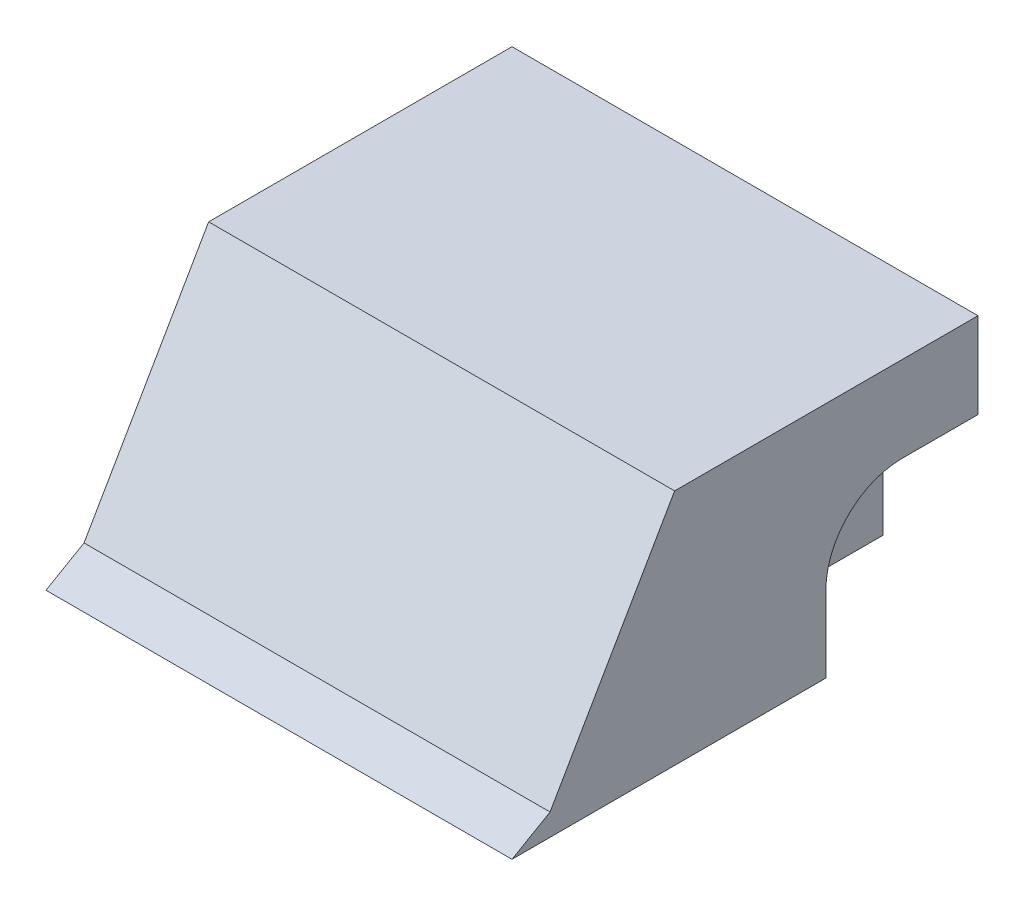
ISO-10303-21;
HEADER;
FILE_DESCRIPTION(('STEP AP214'),'2;1');
FILE_NAME('part.step','',(''),(''),'','','');
FILE_SCHEMA(('AUTOMOTIVE_DESIGN { 1 0 10303 214 1 1 1 1 }'));
ENDSEC;
DATA;
#1=APPLICATION_CONTEXT('core data for automotive mechanical design processes');
#2=APPLICATION_PROTOCOL_DEFINITION('international standard','automotive_design',2000,#1);
#3=PRODUCT_CONTEXT('',#1,'mechanical');
#4=PRODUCT('Part','Part','',(#3));
#5=PRODUCT_RELATED_PRODUCT_CATEGORY('part','',(#4));
#6=PRODUCT_DEFINITION_FORMATION('','',#4);
#7=PRODUCT_DEFINITION_CONTEXT('part definition',#1,'design');
#8=PRODUCT_DEFINITION('design','',#6,#7);
#9=PRODUCT_DEFINITION_SHAPE('','',#8);
#10=(LENGTH_UNIT() NAMED_UNIT(*) SI_UNIT(.MILLI.,.METRE.));
#11=(NAMED_UNIT(*) PLANE_ANGLE_UNIT() SI_UNIT($,.RADIAN.));
#12=(NAMED_UNIT(*) SI_UNIT($,.STERADIAN.) SOLID_ANGLE_UNIT());
#13=UNCERTAINTY_MEASURE_WITH_UNIT(LENGTH_MEASURE(1.E-05),#10,'distance_accuracy_value','');
#14=(GEOMETRIC_REPRESENTATION_CONTEXT(3) GLOBAL_UNCERTAINTY_ASSIGNED_CONTEXT((#13)) GLOBAL_UNIT_ASSIGNED_CONTEXT((#10,
#11,#12)) REPRESENTATION_CONTEXT('',''));
#15=CARTESIAN_POINT('',(0.,0.,0.));
#16=DIRECTION('',(0.,0.,1.));
#17=DIRECTION('',(1.,0.,0.));
#18=AXIS2_PLACEMENT_3D('',#15,#16,#17);
#19=CARTESIAN_POINT('',(-49.,25.,49.));
#20=DIRECTION('',(1.,0.,0.));
#21=DIRECTION('',(0.,0.,-1.));
#22=AXIS2_PLACEMENT_3D('',#19,#20,#21);
#23=PLANE('',#22);
#24=CARTESIAN_POINT('',(-49.,-9.,-33.));
#25=DIRECTION('',(1.,0.,0.));
#26=DIRECTION('',(0.,0.,-1.));
#27=AXIS2_PLACEMENT_3D('',#24,#25,#26);
#28=CIRCLE('',#27,16.);
#29=CARTESIAN_POINT('',(-49.,7.,-33.));
#30=VERTEX_POINT('',#29);
#31=CARTESIAN_POINT('',(-49.,-9.,-17.));
#32=VERTEX_POINT('',#31);
#33=EDGE_CURVE('E256',#30,#32,#28,.T.);
#34=ORIENTED_EDGE('',*,*,#33,.T.);
#35=DIRECTION('',(0.,1.,0.));
#36=VECTOR('',#35,1.);
#37=CARTESIAN_POINT('',(-49.,25.,-17.));
#38=LINE('',#37,#36);
#39=CARTESIAN_POINT('',(-49.,-25.,-17.));
#40=VERTEX_POINT('',#39);
#41=EDGE_CURVE('E243',#40,#32,#38,.T.);
#42=ORIENTED_EDGE('',*,*,#41,.F.);
#43=DIRECTION('',(0.,0.,1.));
#44=VECTOR('',#43,1.);
#45=CARTESIAN_POINT('',(-49.,-25.,49.));
#46=LINE('',#45,#44);
#47=CARTESIAN_POINT('',(-49.,-25.,49.));
#48=VERTEX_POINT('',#47);
#49=EDGE_CURVE('E318',#40,#48,#46,.T.);
#50=ORIENTED_EDGE('',*,*,#49,.T.);
#51=DIRECTION('',(0.,0.500000000000001,-0.866025403784438));
#52=VECTOR('',#51,1.);
#53=CARTESIAN_POINT('',(-49.,2.46762239271881,1.42468245269456));
#54=LINE('',#53,#52);
#55=CARTESIAN_POINT('',(-49.,-20.381197846483,41.));
#56=VERTEX_POINT('',#55);
#57=EDGE_CURVE('E308',#48,#56,#54,.T.);
#58=ORIENTED_EDGE('',*,*,#57,.T.);
#59=DIRECTION('',(0.,0.86602540378444,-0.499999999999998));
#60=VECTOR('',#59,1.);
#61=CARTESIAN_POINT('',(-49.,12.6582213159602,21.9246824526946));
#62=LINE('',#61,#60);
#63=CARTESIAN_POINT('',(-49.,25.,14.7991532071855));
#64=VERTEX_POINT('',#63);
#65=EDGE_CURVE('E311',#56,#64,#62,.T.);
#66=ORIENTED_EDGE('',*,*,#65,.T.);
#67=DIRECTION('',(0.,0.,1.));
#68=VECTOR('',#67,1.);
#69=CARTESIAN_POINT('',(-49.,25.,49.));
#70=LINE('',#69,#68);
#71=CARTESIAN_POINT('',(-49.,25.,-49.));
#72=VERTEX_POINT('',#71);
#73=EDGE_CURVE('E320',#72,#64,#70,.T.);
#74=ORIENTED_EDGE('',*,*,#73,.F.);
#75=DIRECTION('',(0.,-1.,0.));
#76=VECTOR('',#75,1.);
#77=CARTESIAN_POINT('',(-49.,25.,-49.));
#78=LINE('',#77,#76);
#79=CARTESIAN_POINT('',(-49.,7.,-49.));
#80=VERTEX_POINT('',#79);
#81=EDGE_CURVE('E148',#72,#80,#78,.T.);
#82=ORIENTED_EDGE('',*,*,#81,.T.);
#83=DIRECTION('',(0.,0.,1.));
#84=VECTOR('',#83,1.);
#85=CARTESIAN_POINT('',(-49.,7.00000000000001,49.));
#86=LINE('',#85,#84);
#87=EDGE_CURVE('E255',#80,#30,#86,.T.);
#88=ORIENTED_EDGE('',*,*,#87,.T.);
#89=EDGE_LOOP('',(#34,#42,#50,#58,#66,#74,#82,#88));
#90=FACE_BOUND('',#89,.T.);
#91=ADVANCED_FACE('F141',(#90),#23,.F.);
#92=CARTESIAN_POINT('',(49.,25.,49.));
#93=DIRECTION('',(-1.,0.,0.));
#94=DIRECTION('',(0.,0.,1.));
#95=AXIS2_PLACEMENT_3D('',#92,#93,#94);
#96=PLANE('',#95);
#97=DIRECTION('',(0.,0.,-1.));
#98=VECTOR('',#97,1.);
#99=CARTESIAN_POINT('',(49.,-25.,49.));
#100=LINE('',#99,#98);
#101=CARTESIAN_POINT('',(49.,-25.,49.));
#102=VERTEX_POINT('',#101);
#103=CARTESIAN_POINT('',(49.,-25.,-17.));
#104=VERTEX_POINT('',#103);
#105=EDGE_CURVE('E331',#102,#104,#100,.T.);
#106=ORIENTED_EDGE('',*,*,#105,.T.);
#107=DIRECTION('',(0.,-1.,0.));
#108=VECTOR('',#107,1.);
#109=CARTESIAN_POINT('',(49.,25.,-17.));
#110=LINE('',#109,#108);
#111=CARTESIAN_POINT('',(49.,-9.,-17.));
#112=VERTEX_POINT('',#111);
#113=EDGE_CURVE('E163',#112,#104,#110,.T.);
#114=ORIENTED_EDGE('',*,*,#113,.F.);
#115=CARTESIAN_POINT('',(49.,-9.,-33.));
#116=DIRECTION('',(-1.,0.,0.));
#117=DIRECTION('',(0.,0.,1.));
#118=AXIS2_PLACEMENT_3D('',#115,#116,#117);
#119=CIRCLE('',#118,16.);
#120=CARTESIAN_POINT('',(49.,7.,-33.));
#121=VERTEX_POINT('',#120);
#122=EDGE_CURVE('E278',#112,#121,#119,.T.);
#123=ORIENTED_EDGE('',*,*,#122,.T.);
#124=DIRECTION('',(0.,0.,1.));
#125=VECTOR('',#124,1.);
#126=CARTESIAN_POINT('',(49.,7.,49.));
#127=LINE('',#126,#125);
#128=CARTESIAN_POINT('',(49.,7.,-49.));
#129=VERTEX_POINT('',#128);
#130=EDGE_CURVE('E290',#129,#121,#127,.T.);
#131=ORIENTED_EDGE('',*,*,#130,.F.);
#132=DIRECTION('',(0.,-1.,0.));
#133=VECTOR('',#132,1.);
#134=CARTESIAN_POINT('',(49.,25.,-49.));
#135=LINE('',#134,#133);
#136=CARTESIAN_POINT('',(49.,25.,-49.));
#137=VERTEX_POINT('',#136);
#138=EDGE_CURVE('E12',#137,#129,#135,.T.);
#139=ORIENTED_EDGE('',*,*,#138,.F.);
#140=DIRECTION('',(0.,0.,-1.));
#141=VECTOR('',#140,1.);
#142=CARTESIAN_POINT('',(49.,25.,49.));
#143=LINE('',#142,#141);
#144=CARTESIAN_POINT('',(49.,25.,14.7991532071855));
#145=VERTEX_POINT('',#144);
#146=EDGE_CURVE('E323',#145,#137,#143,.T.);
#147=ORIENTED_EDGE('',*,*,#146,.F.);
#148=DIRECTION('',(0.,0.86602540378444,-0.499999999999998));
#149=VECTOR('',#148,1.);
#150=CARTESIAN_POINT('',(49.,12.6582213159602,21.9246824526946));
#151=LINE('',#150,#149);
#152=CARTESIAN_POINT('',(49.,-20.381197846483,41.));
#153=VERTEX_POINT('',#152);
#154=EDGE_CURVE('E306',#153,#145,#151,.T.);
#155=ORIENTED_EDGE('',*,*,#154,.F.);
#156=DIRECTION('',(0.,0.500000000000001,-0.866025403784438));
#157=VECTOR('',#156,1.);
#158=CARTESIAN_POINT('',(49.,2.46762239271881,1.42468245269456));
#159=LINE('',#158,#157);
#160=EDGE_CURVE('E285',#102,#153,#159,.T.);
#161=ORIENTED_EDGE('',*,*,#160,.F.);
#162=EDGE_LOOP('',(#106,#114,#123,#131,#139,#147,#155,#161));
#163=FACE_BOUND('',#162,.T.);
#164=ADVANCED_FACE('F355',(#163),#96,.F.);
#165=CARTESIAN_POINT('',(49.,25.,-49.));
#166=DIRECTION('',(0.,0.,1.));
#167=DIRECTION('',(1.,0.,0.));
#168=AXIS2_PLACEMENT_3D('',#165,#166,#167);
#169=PLANE('',#168);
#170=DIRECTION('',(-1.,0.,0.));
#171=VECTOR('',#170,1.);
#172=CARTESIAN_POINT('',(49.,-25.,-49.));
#173=LINE('',#172,#171);
#174=CARTESIAN_POINT('',(29.,-25.,-49.));
#175=VERTEX_POINT('',#174);
#176=CARTESIAN_POINT('',(-29.,-25.,-49.));
#177=VERTEX_POINT('',#176);
#178=EDGE_CURVE('E324',#175,#177,#173,.T.);
#179=ORIENTED_EDGE('',*,*,#178,.T.);
#180=DIRECTION('',(0.,1.,0.));
#181=VECTOR('',#180,1.);
#182=CARTESIAN_POINT('',(-29.,25.,-49.));
#183=LINE('',#182,#181);
#184=CARTESIAN_POINT('',(-29.,7.,-49.));
#185=VERTEX_POINT('',#184);
#186=EDGE_CURVE('E155',#177,#185,#183,.T.);
#187=ORIENTED_EDGE('',*,*,#186,.T.);
#188=DIRECTION('',(-1.,0.,0.));
#189=VECTOR('',#188,1.);
#190=CARTESIAN_POINT('',(-29.,7.,-49.));
#191=LINE('',#190,#189);
#192=EDGE_CURVE('E267',#185,#80,#191,.T.);
#193=ORIENTED_EDGE('',*,*,#192,.T.);
#194=ORIENTED_EDGE('',*,*,#81,.F.);
#195=DIRECTION('',(-1.,0.,0.));
#196=VECTOR('',#195,1.);
#197=CARTESIAN_POINT('',(49.,25.,-49.));
#198=LINE('',#197,#196);
#199=EDGE_CURVE('E326',#137,#72,#198,.T.);
#200=ORIENTED_EDGE('',*,*,#199,.F.);
#201=ORIENTED_EDGE('',*,*,#138,.T.);
#202=DIRECTION('',(1.,0.,0.));
#203=VECTOR('',#202,1.);
#204=CARTESIAN_POINT('',(29.,7.,-49.));
#205=LINE('',#204,#203);
#206=CARTESIAN_POINT('',(29.,7.,-49.));
#207=VERTEX_POINT('',#206);
#208=EDGE_CURVE('E281',#207,#129,#205,.T.);
#209=ORIENTED_EDGE('',*,*,#208,.F.);
#210=DIRECTION('',(0.,1.,0.));
#211=VECTOR('',#210,1.);
#212=CARTESIAN_POINT('',(29.,25.,-49.));
#213=LINE('',#212,#211);
#214=EDGE_CURVE('E293',#175,#207,#213,.T.);
#215=ORIENTED_EDGE('',*,*,#214,.F.);
#216=EDGE_LOOP('',(#179,#187,#193,#194,#200,#201,#209,#215));
#217=FACE_BOUND('',#216,.T.);
#218=ADVANCED_FACE('F341',(#217),#169,.F.);
#219=CARTESIAN_POINT('',(0.,25.,0.));
#220=DIRECTION('',(0.,1.,0.));
#221=DIRECTION('',(0.,0.,1.));
#222=AXIS2_PLACEMENT_3D('',#219,#220,#221);
#223=PLANE('',#222);
#224=DIRECTION('',(1.,0.,0.));
#225=VECTOR('',#224,1.);
#226=CARTESIAN_POINT('',(-49.,25.,14.7991532071855));
#227=LINE('',#226,#225);
#228=EDGE_CURVE('E315',#64,#145,#227,.T.);
#229=ORIENTED_EDGE('',*,*,#228,.T.);
#230=ORIENTED_EDGE('',*,*,#146,.T.);
#231=ORIENTED_EDGE('',*,*,#199,.T.);
#232=ORIENTED_EDGE('',*,*,#73,.T.);
#233=EDGE_LOOP('',(#229,#230,#231,#232));
#234=FACE_BOUND('',#233,.T.);
#235=ADVANCED_FACE('F362',(#234),#223,.T.);
#236=CARTESIAN_POINT('',(0.,-25.,0.));
#237=DIRECTION('',(0.,1.,0.));
#238=DIRECTION('',(0.,0.,1.));
#239=AXIS2_PLACEMENT_3D('',#236,#237,#238);
#240=PLANE('',#239);
#241=ORIENTED_EDGE('',*,*,#49,.F.);
#242=DIRECTION('',(-1.,0.,0.));
#243=VECTOR('',#242,1.);
#244=CARTESIAN_POINT('',(-29.,-25.,-17.));
#245=LINE('',#244,#243);
#246=CARTESIAN_POINT('',(-29.,-25.,-17.));
#247=VERTEX_POINT('',#246);
#248=EDGE_CURVE('E247',#247,#40,#245,.T.);
#249=ORIENTED_EDGE('',*,*,#248,.F.);
#250=DIRECTION('',(0.,0.,1.));
#251=VECTOR('',#250,1.);
#252=CARTESIAN_POINT('',(-29.,-25.,49.));
#253=LINE('',#252,#251);
#254=EDGE_CURVE('E248',#177,#247,#253,.T.);
#255=ORIENTED_EDGE('',*,*,#254,.F.);
#256=ORIENTED_EDGE('',*,*,#178,.F.);
#257=DIRECTION('',(0.,0.,1.));
#258=VECTOR('',#257,1.);
#259=CARTESIAN_POINT('',(29.,-25.,49.));
#260=LINE('',#259,#258);
#261=CARTESIAN_POINT('',(29.,-25.,-17.));
#262=VERTEX_POINT('',#261);
#263=EDGE_CURVE('E289',#175,#262,#260,.T.);
#264=ORIENTED_EDGE('',*,*,#263,.T.);
#265=DIRECTION('',(1.,0.,0.));
#266=VECTOR('',#265,1.);
#267=CARTESIAN_POINT('',(29.,-25.,-17.));
#268=LINE('',#267,#266);
#269=EDGE_CURVE('E297',#262,#104,#268,.T.);
#270=ORIENTED_EDGE('',*,*,#269,.T.);
#271=ORIENTED_EDGE('',*,*,#105,.F.);
#272=DIRECTION('',(1.,0.,0.));
#273=VECTOR('',#272,1.);
#274=CARTESIAN_POINT('',(49.,-25.,49.));
#275=LINE('',#274,#273);
#276=EDGE_CURVE('E329',#48,#102,#275,.T.);
#277=ORIENTED_EDGE('',*,*,#276,.F.);
#278=EDGE_LOOP('',(#241,#249,#255,#256,#264,#270,#271,#277));
#279=FACE_BOUND('',#278,.T.);
#280=ADVANCED_FACE('F348',(#279),#240,.F.);
#281=CARTESIAN_POINT('',(-49.,12.6582213159602,21.9246824526946));
#282=DIRECTION('',(0.,-0.499999999999998,-0.86602540378444));
#283=DIRECTION('',(0.,0.86602540378444,-0.499999999999998));
#284=AXIS2_PLACEMENT_3D('',#281,#282,#283);
#285=PLANE('',#284);
#286=ORIENTED_EDGE('',*,*,#228,.F.);
#287=ORIENTED_EDGE('',*,*,#65,.F.);
#288=DIRECTION('',(1.,0.,0.));
#289=VECTOR('',#288,1.);
#290=CARTESIAN_POINT('',(-49.,-20.381197846483,41.));
#291=LINE('',#290,#289);
#292=EDGE_CURVE('E314',#56,#153,#291,.T.);
#293=ORIENTED_EDGE('',*,*,#292,.T.);
#294=ORIENTED_EDGE('',*,*,#154,.T.);
#295=EDGE_LOOP('',(#286,#287,#293,#294));
#296=FACE_BOUND('',#295,.T.);
#297=ADVANCED_FACE('F359',(#296),#285,.F.);
#298=CARTESIAN_POINT('',(-49.,2.46762239271881,1.42468245269456));
#299=DIRECTION('',(0.,-0.866025403784438,-0.500000000000001));
#300=DIRECTION('',(0.,0.500000000000001,-0.866025403784438));
#301=AXIS2_PLACEMENT_3D('',#298,#299,#300);
#302=PLANE('',#301);
#303=ORIENTED_EDGE('',*,*,#292,.F.);
#304=ORIENTED_EDGE('',*,*,#57,.F.);
#305=ORIENTED_EDGE('',*,*,#276,.T.);
#306=ORIENTED_EDGE('',*,*,#160,.T.);
#307=EDGE_LOOP('',(#303,#304,#305,#306));
#308=FACE_BOUND('',#307,.T.);
#309=ADVANCED_FACE('F352',(#308),#302,.F.);
#310=CARTESIAN_POINT('',(29.,-9.,-33.));
#311=DIRECTION('',(-1.,0.,0.));
#312=DIRECTION('',(0.,0.,1.));
#313=AXIS2_PLACEMENT_3D('',#310,#311,#312);
#314=PLANE('',#313);
#315=ORIENTED_EDGE('',*,*,#263,.F.);
#316=ORIENTED_EDGE('',*,*,#214,.T.);
#317=DIRECTION('',(0.,0.,1.));
#318=VECTOR('',#317,1.);
#319=CARTESIAN_POINT('',(29.,7.,49.));
#320=LINE('',#319,#318);
#321=CARTESIAN_POINT('',(29.,7.,-33.));
#322=VERTEX_POINT('',#321);
#323=EDGE_CURVE('E286',#207,#322,#320,.T.);
#324=ORIENTED_EDGE('',*,*,#323,.T.);
#325=CARTESIAN_POINT('',(29.,-9.,-33.));
#326=DIRECTION('',(-1.,0.,0.));
#327=DIRECTION('',(0.,0.,1.));
#328=AXIS2_PLACEMENT_3D('',#325,#326,#327);
#329=CIRCLE('',#328,16.);
#330=CARTESIAN_POINT('',(29.,-9.,-17.));
#331=VERTEX_POINT('',#330);
#332=EDGE_CURVE('E274',#331,#322,#329,.T.);
#333=ORIENTED_EDGE('',*,*,#332,.F.);
#334=DIRECTION('',(0.,-1.,0.));
#335=VECTOR('',#334,1.);
#336=CARTESIAN_POINT('',(29.,25.,-17.));
#337=LINE('',#336,#335);
#338=EDGE_CURVE('E299',#331,#262,#337,.T.);
#339=ORIENTED_EDGE('',*,*,#338,.T.);
#340=EDGE_LOOP('',(#315,#316,#324,#333,#339));
#341=FACE_BOUND('',#340,.T.);
#342=ADVANCED_FACE('F372',(#341),#314,.F.);
#343=CARTESIAN_POINT('',(29.,-9.,-33.));
#344=DIRECTION('',(1.,0.,0.));
#345=DIRECTION('',(0.,0.,-1.));
#346=AXIS2_PLACEMENT_3D('',#343,#344,#345);
#347=CYLINDRICAL_SURFACE('',#346,16.);
#348=DIRECTION('',(1.,0.,0.));
#349=VECTOR('',#348,1.);
#350=CARTESIAN_POINT('',(29.,7.,-33.));
#351=LINE('',#350,#349);
#352=EDGE_CURVE('E283',#322,#121,#351,.T.);
#353=ORIENTED_EDGE('',*,*,#352,.T.);
#354=ORIENTED_EDGE('',*,*,#122,.F.);
#355=DIRECTION('',(1.,0.,0.));
#356=VECTOR('',#355,1.);
#357=CARTESIAN_POINT('',(29.,-9.,-17.));
#358=LINE('',#357,#356);
#359=EDGE_CURVE('E277',#331,#112,#358,.T.);
#360=ORIENTED_EDGE('',*,*,#359,.F.);
#361=ORIENTED_EDGE('',*,*,#332,.T.);
#362=EDGE_LOOP('',(#353,#354,#360,#361));
#363=FACE_BOUND('',#362,.T.);
#364=ADVANCED_FACE('F374',(#363),#347,.F.);
#365=CARTESIAN_POINT('',(29.,25.,-17.));
#366=DIRECTION('',(0.,0.,1.));
#367=DIRECTION('',(1.,0.,0.));
#368=AXIS2_PLACEMENT_3D('',#365,#366,#367);
#369=PLANE('',#368);
#370=ORIENTED_EDGE('',*,*,#113,.T.);
#371=ORIENTED_EDGE('',*,*,#269,.F.);
#372=ORIENTED_EDGE('',*,*,#338,.F.);
#373=ORIENTED_EDGE('',*,*,#359,.T.);
#374=EDGE_LOOP('',(#370,#371,#372,#373));
#375=FACE_BOUND('',#374,.T.);
#376=ADVANCED_FACE('F377',(#375),#369,.F.);
#377=CARTESIAN_POINT('',(29.,7.,49.));
#378=DIRECTION('',(0.,1.,0.));
#379=DIRECTION('',(0.,0.,1.));
#380=AXIS2_PLACEMENT_3D('',#377,#378,#379);
#381=PLANE('',#380);
#382=ORIENTED_EDGE('',*,*,#130,.T.);
#383=ORIENTED_EDGE('',*,*,#352,.F.);
#384=ORIENTED_EDGE('',*,*,#323,.F.);
#385=ORIENTED_EDGE('',*,*,#208,.T.);
#386=EDGE_LOOP('',(#382,#383,#384,#385));
#387=FACE_BOUND('',#386,.T.);
#388=ADVANCED_FACE('F369',(#387),#381,.F.);
#389=CARTESIAN_POINT('',(-29.,25.,-17.));
#390=DIRECTION('',(0.,0.,1.));
#391=DIRECTION('',(1.,0.,0.));
#392=AXIS2_PLACEMENT_3D('',#389,#390,#391);
#393=PLANE('',#392);
#394=ORIENTED_EDGE('',*,*,#41,.T.);
#395=DIRECTION('',(-1.,0.,0.));
#396=VECTOR('',#395,1.);
#397=CARTESIAN_POINT('',(-29.,-9.,-17.));
#398=LINE('',#397,#396);
#399=CARTESIAN_POINT('',(-29.,-9.,-17.));
#400=VERTEX_POINT('',#399);
#401=EDGE_CURVE('E236',#400,#32,#398,.T.);
#402=ORIENTED_EDGE('',*,*,#401,.F.);
#403=DIRECTION('',(0.,1.,0.));
#404=VECTOR('',#403,1.);
#405=CARTESIAN_POINT('',(-29.,25.,-17.));
#406=LINE('',#405,#404);
#407=EDGE_CURVE('E240',#247,#400,#406,.T.);
#408=ORIENTED_EDGE('',*,*,#407,.F.);
#409=ORIENTED_EDGE('',*,*,#248,.T.);
#410=EDGE_LOOP('',(#394,#402,#408,#409));
#411=FACE_BOUND('',#410,.T.);
#412=ADVANCED_FACE('F238',(#411),#393,.F.);
#413=CARTESIAN_POINT('',(-29.,0.,0.));
#414=DIRECTION('',(1.,0.,0.));
#415=DIRECTION('',(0.,0.,-1.));
#416=AXIS2_PLACEMENT_3D('',#413,#414,#415);
#417=PLANE('',#416);
#418=DIRECTION('',(0.,0.,1.));
#419=VECTOR('',#418,1.);
#420=CARTESIAN_POINT('',(-29.,7.00000000000001,49.));
#421=LINE('',#420,#419);
#422=CARTESIAN_POINT('',(-29.,7.,-33.));
#423=VERTEX_POINT('',#422);
#424=EDGE_CURVE('E265',#185,#423,#421,.T.);
#425=ORIENTED_EDGE('',*,*,#424,.F.);
#426=ORIENTED_EDGE('',*,*,#186,.F.);
#427=ORIENTED_EDGE('',*,*,#254,.T.);
#428=ORIENTED_EDGE('',*,*,#407,.T.);
#429=CARTESIAN_POINT('',(-29.,-9.,-33.));
#430=DIRECTION('',(1.,0.,0.));
#431=DIRECTION('',(0.,0.,-1.));
#432=AXIS2_PLACEMENT_3D('',#429,#430,#431);
#433=CIRCLE('',#432,16.);
#434=EDGE_CURVE('E251',#423,#400,#433,.T.);
#435=ORIENTED_EDGE('',*,*,#434,.F.);
#436=EDGE_LOOP('',(#425,#426,#427,#428,#435));
#437=FACE_BOUND('',#436,.T.);
#438=ADVANCED_FACE('F258',(#437),#417,.F.);
#439=CARTESIAN_POINT('',(-29.,7.00000000000001,49.));
#440=DIRECTION('',(0.,-1.,0.));
#441=DIRECTION('',(0.,0.,-1.));
#442=AXIS2_PLACEMENT_3D('',#439,#440,#441);
#443=PLANE('',#442);
#444=ORIENTED_EDGE('',*,*,#87,.F.);
#445=ORIENTED_EDGE('',*,*,#192,.F.);
#446=ORIENTED_EDGE('',*,*,#424,.T.);
#447=DIRECTION('',(-1.,0.,0.));
#448=VECTOR('',#447,1.);
#449=CARTESIAN_POINT('',(-29.,7.,-33.));
#450=LINE('',#449,#448);
#451=EDGE_CURVE('E253',#423,#30,#450,.T.);
#452=ORIENTED_EDGE('',*,*,#451,.T.);
#453=EDGE_LOOP('',(#444,#445,#446,#452));
#454=FACE_BOUND('',#453,.T.);
#455=ADVANCED_FACE('F343',(#454),#443,.T.);
#456=CARTESIAN_POINT('',(-29.,-9.,-33.));
#457=DIRECTION('',(-1.,0.,0.));
#458=DIRECTION('',(0.,0.,1.));
#459=AXIS2_PLACEMENT_3D('',#456,#457,#458);
#460=CYLINDRICAL_SURFACE('',#459,16.);
#461=ORIENTED_EDGE('',*,*,#33,.F.);
#462=ORIENTED_EDGE('',*,*,#451,.F.);
#463=ORIENTED_EDGE('',*,*,#434,.T.);
#464=ORIENTED_EDGE('',*,*,#401,.T.);
#465=EDGE_LOOP('',(#461,#462,#463,#464));
#466=FACE_BOUND('',#465,.T.);
#467=ADVANCED_FACE('F252',(#466),#460,.F.);
#468=CLOSED_SHELL('',(#91,#164,#218,#235,#280,#297,#309,#342,#364,#376,#388,#412,#438,#455,#467));
#469=MANIFOLD_SOLID_BREP('B2',#468);
#470=ADVANCED_BREP_SHAPE_REPRESENTATION('',(#18,#469),#14);
#471=SHAPE_DEFINITION_REPRESENTATION(#9,#470);
ENDSEC;
END-ISO-10303-21;
